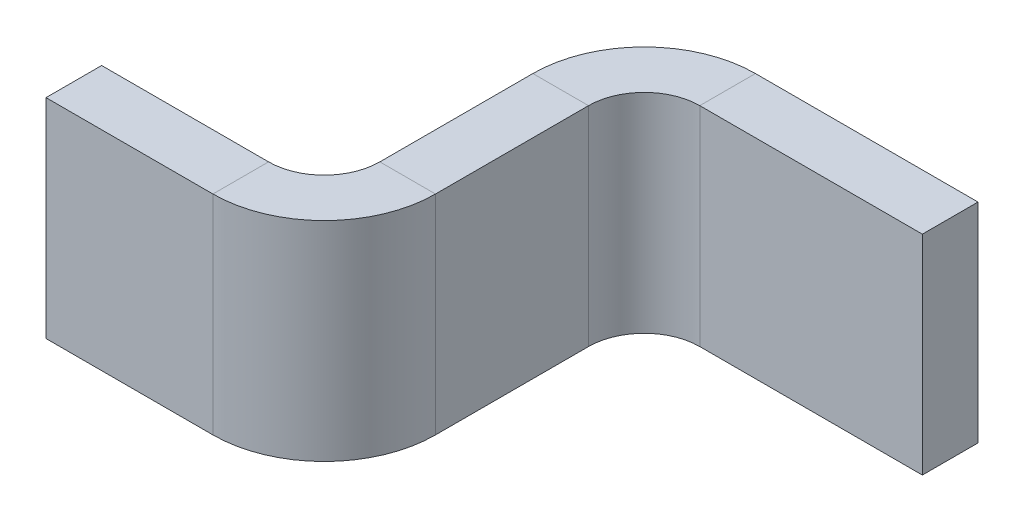
ISO-10303-21;
HEADER;
FILE_DESCRIPTION(('STEP AP214'),'2;1');
FILE_NAME('part.step','',(''),(''),'','','');
FILE_SCHEMA(('AUTOMOTIVE_DESIGN { 1 0 10303 214 1 1 1 1 }'));
ENDSEC;
DATA;
#1=APPLICATION_CONTEXT('core data for automotive mechanical design processes');
#2=APPLICATION_PROTOCOL_DEFINITION('international standard','automotive_design',2000,#1);
#3=PRODUCT_CONTEXT('',#1,'mechanical');
#4=PRODUCT('Part','Part','',(#3));
#5=PRODUCT_RELATED_PRODUCT_CATEGORY('part','',(#4));
#6=PRODUCT_DEFINITION_FORMATION('','',#4);
#7=PRODUCT_DEFINITION_CONTEXT('part definition',#1,'design');
#8=PRODUCT_DEFINITION('design','',#6,#7);
#9=PRODUCT_DEFINITION_SHAPE('','',#8);
#10=(LENGTH_UNIT() NAMED_UNIT(*) SI_UNIT(.MILLI.,.METRE.));
#11=(NAMED_UNIT(*) PLANE_ANGLE_UNIT() SI_UNIT($,.RADIAN.));
#12=(NAMED_UNIT(*) SI_UNIT($,.STERADIAN.) SOLID_ANGLE_UNIT());
#13=UNCERTAINTY_MEASURE_WITH_UNIT(LENGTH_MEASURE(1.E-05),#10,'distance_accuracy_value','');
#14=(GEOMETRIC_REPRESENTATION_CONTEXT(3) GLOBAL_UNCERTAINTY_ASSIGNED_CONTEXT((#13)) GLOBAL_UNIT_ASSIGNED_CONTEXT((#10,
#11,#12)) REPRESENTATION_CONTEXT('',''));
#15=CARTESIAN_POINT('',(0.,0.,0.));
#16=DIRECTION('',(0.,0.,1.));
#17=DIRECTION('',(1.,0.,0.));
#18=AXIS2_PLACEMENT_3D('',#15,#16,#17);
#19=CARTESIAN_POINT('',(0.,-0.1875,0.575));
#20=DIRECTION('',(-1.,0.,0.));
#21=DIRECTION('',(0.,0.,1.));
#22=AXIS2_PLACEMENT_3D('',#19,#20,#21);
#23=PLANE('',#22);
#24=DIRECTION('',(0.,0.,1.));
#25=VECTOR('',#24,1.);
#26=CARTESIAN_POINT('',(0.,-0.1875,0.675));
#27=LINE('',#26,#25);
#28=CARTESIAN_POINT('',(0.,-0.1875,0.575));
#29=VERTEX_POINT('',#28);
#30=CARTESIAN_POINT('',(0.,-0.1875,0.675));
#31=VERTEX_POINT('',#30);
#32=EDGE_CURVE('E11',#29,#31,#27,.T.);
#33=ORIENTED_EDGE('',*,*,#32,.T.);
#34=DIRECTION('',(0.,1.,0.));
#35=VECTOR('',#34,1.);
#36=CARTESIAN_POINT('',(0.,0.1875,0.675));
#37=LINE('',#36,#35);
#38=CARTESIAN_POINT('',(0.,0.1875,0.675));
#39=VERTEX_POINT('',#38);
#40=EDGE_CURVE('E28',#31,#39,#37,.T.);
#41=ORIENTED_EDGE('',*,*,#40,.T.);
#42=DIRECTION('',(0.,0.,-1.));
#43=VECTOR('',#42,1.);
#44=CARTESIAN_POINT('',(0.,0.1875,0.575));
#45=LINE('',#44,#43);
#46=CARTESIAN_POINT('',(0.,0.1875,0.575));
#47=VERTEX_POINT('',#46);
#48=EDGE_CURVE('E148',#39,#47,#45,.T.);
#49=ORIENTED_EDGE('',*,*,#48,.T.);
#50=DIRECTION('',(0.,-1.,0.));
#51=VECTOR('',#50,1.);
#52=CARTESIAN_POINT('',(0.,-0.1875,0.575));
#53=LINE('',#52,#51);
#54=EDGE_CURVE('E194',#47,#29,#53,.T.);
#55=ORIENTED_EDGE('',*,*,#54,.T.);
#56=EDGE_LOOP('',(#33,#41,#49,#55));
#57=FACE_BOUND('',#56,.T.);
#58=ADVANCED_FACE('F17',(#57),#23,.T.);
#59=CARTESIAN_POINT('',(0.,-0.1875,0.575));
#60=DIRECTION('',(0.,0.,1.));
#61=DIRECTION('',(1.,0.,0.));
#62=AXIS2_PLACEMENT_3D('',#59,#60,#61);
#63=PLANE('',#62);
#64=DIRECTION('',(0.,-1.,0.));
#65=VECTOR('',#64,1.);
#66=CARTESIAN_POINT('',(0.3,-0.1875,0.575));
#67=LINE('',#66,#65);
#68=CARTESIAN_POINT('',(0.3,0.1875,0.575));
#69=VERTEX_POINT('',#68);
#70=CARTESIAN_POINT('',(0.3,-0.1875,0.575));
#71=VERTEX_POINT('',#70);
#72=EDGE_CURVE('E207',#69,#71,#67,.T.);
#73=ORIENTED_EDGE('',*,*,#72,.T.);
#74=DIRECTION('',(1.,0.,0.));
#75=VECTOR('',#74,1.);
#76=CARTESIAN_POINT('',(0.,-0.1875,0.575));
#77=LINE('',#76,#75);
#78=EDGE_CURVE('E238',#29,#71,#77,.T.);
#79=ORIENTED_EDGE('',*,*,#78,.F.);
#80=ORIENTED_EDGE('',*,*,#54,.F.);
#81=DIRECTION('',(1.,0.,0.));
#82=VECTOR('',#81,1.);
#83=CARTESIAN_POINT('',(0.,0.1875,0.575));
#84=LINE('',#83,#82);
#85=EDGE_CURVE('E210',#47,#69,#84,.T.);
#86=ORIENTED_EDGE('',*,*,#85,.T.);
#87=EDGE_LOOP('',(#73,#79,#80,#86));
#88=FACE_BOUND('',#87,.T.);
#89=ADVANCED_FACE('F377',(#88),#63,.F.);
#90=CARTESIAN_POINT('',(0.3,-0.1875,0.475));
#91=DIRECTION('',(0.,1.,0.));
#92=DIRECTION('',(0.,0.,-1.));
#93=AXIS2_PLACEMENT_3D('',#90,#91,#92);
#94=CYLINDRICAL_SURFACE('',#93,0.1);
#95=DIRECTION('',(0.,1.,0.));
#96=VECTOR('',#95,1.);
#97=CARTESIAN_POINT('',(0.4,-0.1875,0.475));
#98=LINE('',#97,#96);
#99=CARTESIAN_POINT('',(0.4,-0.1875,0.475));
#100=VERTEX_POINT('',#99);
#101=CARTESIAN_POINT('',(0.4,0.1875,0.475));
#102=VERTEX_POINT('',#101);
#103=EDGE_CURVE('E268',#100,#102,#98,.T.);
#104=ORIENTED_EDGE('',*,*,#103,.F.);
#105=CARTESIAN_POINT('',(0.3,-0.1875,0.475));
#106=DIRECTION('',(0.,1.,0.));
#107=DIRECTION('',(0.,0.,-1.));
#108=AXIS2_PLACEMENT_3D('',#105,#106,#107);
#109=CIRCLE('',#108,0.1);
#110=EDGE_CURVE('E234',#71,#100,#109,.T.);
#111=ORIENTED_EDGE('',*,*,#110,.F.);
#112=ORIENTED_EDGE('',*,*,#72,.F.);
#113=CARTESIAN_POINT('',(0.3,0.1875,0.475));
#114=DIRECTION('',(0.,1.,0.));
#115=DIRECTION('',(0.,0.,-1.));
#116=AXIS2_PLACEMENT_3D('',#113,#114,#115);
#117=CIRCLE('',#116,0.1);
#118=EDGE_CURVE('E160',#69,#102,#117,.T.);
#119=ORIENTED_EDGE('',*,*,#118,.T.);
#120=EDGE_LOOP('',(#104,#111,#112,#119));
#121=FACE_BOUND('',#120,.T.);
#122=ADVANCED_FACE('F381',(#121),#94,.F.);
#123=CARTESIAN_POINT('',(0.4,-0.1875,0.475));
#124=DIRECTION('',(1.,0.,0.));
#125=DIRECTION('',(0.,1.,0.));
#126=AXIS2_PLACEMENT_3D('',#123,#124,#125);
#127=PLANE('',#126);
#128=DIRECTION('',(0.,-1.,0.));
#129=VECTOR('',#128,1.);
#130=CARTESIAN_POINT('',(0.4,-0.1875,0.2));
#131=LINE('',#130,#129);
#132=CARTESIAN_POINT('',(0.4,0.1875,0.2));
#133=VERTEX_POINT('',#132);
#134=CARTESIAN_POINT('',(0.4,-0.1875,0.2));
#135=VERTEX_POINT('',#134);
#136=EDGE_CURVE('E250',#133,#135,#131,.T.);
#137=ORIENTED_EDGE('',*,*,#136,.T.);
#138=DIRECTION('',(0.,0.,-1.));
#139=VECTOR('',#138,1.);
#140=CARTESIAN_POINT('',(0.4,-0.1875,0.475));
#141=LINE('',#140,#139);
#142=EDGE_CURVE('E179',#100,#135,#141,.T.);
#143=ORIENTED_EDGE('',*,*,#142,.F.);
#144=ORIENTED_EDGE('',*,*,#103,.T.);
#145=DIRECTION('',(0.,0.,-1.));
#146=VECTOR('',#145,1.);
#147=CARTESIAN_POINT('',(0.4,0.1875,0.475));
#148=LINE('',#147,#146);
#149=EDGE_CURVE('E21',#102,#133,#148,.T.);
#150=ORIENTED_EDGE('',*,*,#149,.T.);
#151=EDGE_LOOP('',(#137,#143,#144,#150));
#152=FACE_BOUND('',#151,.T.);
#153=ADVANCED_FACE('F397',(#152),#127,.F.);
#154=CARTESIAN_POINT('',(0.6,-0.1875,0.2));
#155=DIRECTION('',(0.,-1.,0.));
#156=DIRECTION('',(0.,0.,-1.));
#157=AXIS2_PLACEMENT_3D('',#154,#155,#156);
#158=CYLINDRICAL_SURFACE('',#157,0.2);
#159=CARTESIAN_POINT('',(0.6,0.1875,0.2));
#160=DIRECTION('',(0.,-1.,0.));
#161=DIRECTION('',(0.,0.,-1.));
#162=AXIS2_PLACEMENT_3D('',#159,#160,#161);
#163=CIRCLE('',#162,0.2);
#164=CARTESIAN_POINT('',(0.6,0.1875,0.));
#165=VERTEX_POINT('',#164);
#166=EDGE_CURVE('E199',#133,#165,#163,.T.);
#167=ORIENTED_EDGE('',*,*,#166,.T.);
#168=DIRECTION('',(0.,-1.,0.));
#169=VECTOR('',#168,1.);
#170=CARTESIAN_POINT('',(0.6,-0.1875,0.));
#171=LINE('',#170,#169);
#172=CARTESIAN_POINT('',(0.6,-0.1875,0.));
#173=VERTEX_POINT('',#172);
#174=EDGE_CURVE('E203',#165,#173,#171,.T.);
#175=ORIENTED_EDGE('',*,*,#174,.T.);
#176=CARTESIAN_POINT('',(0.6,-0.1875,0.2));
#177=DIRECTION('',(0.,-1.,0.));
#178=DIRECTION('',(0.,0.,-1.));
#179=AXIS2_PLACEMENT_3D('',#176,#177,#178);
#180=CIRCLE('',#179,0.2);
#181=EDGE_CURVE('E191',#135,#173,#180,.T.);
#182=ORIENTED_EDGE('',*,*,#181,.F.);
#183=ORIENTED_EDGE('',*,*,#136,.F.);
#184=EDGE_LOOP('',(#167,#175,#182,#183));
#185=FACE_BOUND('',#184,.T.);
#186=ADVANCED_FACE('F304',(#185),#158,.T.);
#187=CARTESIAN_POINT('',(0.6,-0.1875,0.));
#188=DIRECTION('',(0.,0.,1.));
#189=DIRECTION('',(1.,0.,0.));
#190=AXIS2_PLACEMENT_3D('',#187,#188,#189);
#191=PLANE('',#190);
#192=DIRECTION('',(0.,-1.,0.));
#193=VECTOR('',#192,1.);
#194=CARTESIAN_POINT('',(1.,-0.1875,0.));
#195=LINE('',#194,#193);
#196=CARTESIAN_POINT('',(1.,0.1875,0.));
#197=VERTEX_POINT('',#196);
#198=CARTESIAN_POINT('',(1.,-0.1875,0.));
#199=VERTEX_POINT('',#198);
#200=EDGE_CURVE('E214',#197,#199,#195,.T.);
#201=ORIENTED_EDGE('',*,*,#200,.T.);
#202=DIRECTION('',(1.,0.,0.));
#203=VECTOR('',#202,1.);
#204=CARTESIAN_POINT('',(0.6,-0.1875,0.));
#205=LINE('',#204,#203);
#206=EDGE_CURVE('E156',#173,#199,#205,.T.);
#207=ORIENTED_EDGE('',*,*,#206,.F.);
#208=ORIENTED_EDGE('',*,*,#174,.F.);
#209=DIRECTION('',(1.,0.,0.));
#210=VECTOR('',#209,1.);
#211=CARTESIAN_POINT('',(0.6,0.1875,0.));
#212=LINE('',#211,#210);
#213=EDGE_CURVE('E218',#165,#197,#212,.T.);
#214=ORIENTED_EDGE('',*,*,#213,.T.);
#215=EDGE_LOOP('',(#201,#207,#208,#214));
#216=FACE_BOUND('',#215,.T.);
#217=ADVANCED_FACE('F341',(#216),#191,.F.);
#218=CARTESIAN_POINT('',(0.,-0.1875,0.675));
#219=DIRECTION('',(0.,1.,0.));
#220=DIRECTION('',(1.,0.,0.));
#221=AXIS2_PLACEMENT_3D('',#218,#219,#220);
#222=PLANE('',#221);
#223=DIRECTION('',(0.,0.,1.));
#224=VECTOR('',#223,1.);
#225=CARTESIAN_POINT('',(0.3,-0.1875,0.675));
#226=LINE('',#225,#224);
#227=CARTESIAN_POINT('',(0.3,-0.1875,0.675));
#228=VERTEX_POINT('',#227);
#229=EDGE_CURVE('E171',#71,#228,#226,.T.);
#230=ORIENTED_EDGE('',*,*,#229,.T.);
#231=DIRECTION('',(1.,0.,0.));
#232=VECTOR('',#231,1.);
#233=CARTESIAN_POINT('',(0.,-0.1875,0.675));
#234=LINE('',#233,#232);
#235=EDGE_CURVE('E153',#31,#228,#234,.T.);
#236=ORIENTED_EDGE('',*,*,#235,.F.);
#237=ORIENTED_EDGE('',*,*,#32,.F.);
#238=ORIENTED_EDGE('',*,*,#78,.T.);
#239=EDGE_LOOP('',(#230,#236,#237,#238));
#240=FACE_BOUND('',#239,.T.);
#241=ADVANCED_FACE('F19',(#240),#222,.F.);
#242=CARTESIAN_POINT('',(0.406066017178,-0.1875,0.581066017178));
#243=DIRECTION('',(0.,-1.,0.));
#244=DIRECTION('',(0.,0.,-1.));
#245=AXIS2_PLACEMENT_3D('',#242,#243,#244);
#246=PLANE('',#245);
#247=ORIENTED_EDGE('',*,*,#110,.T.);
#248=DIRECTION('',(1.,0.,0.));
#249=VECTOR('',#248,1.);
#250=CARTESIAN_POINT('',(0.5,-0.1875,0.475));
#251=LINE('',#250,#249);
#252=CARTESIAN_POINT('',(0.5,-0.1875,0.475));
#253=VERTEX_POINT('',#252);
#254=EDGE_CURVE('E178',#100,#253,#251,.T.);
#255=ORIENTED_EDGE('',*,*,#254,.T.);
#256=CARTESIAN_POINT('',(0.3,-0.1875,0.475));
#257=DIRECTION('',(0.,1.,0.));
#258=DIRECTION('',(0.,0.,-1.));
#259=AXIS2_PLACEMENT_3D('',#256,#257,#258);
#260=CIRCLE('',#259,0.2);
#261=EDGE_CURVE('E283',#228,#253,#260,.T.);
#262=ORIENTED_EDGE('',*,*,#261,.F.);
#263=ORIENTED_EDGE('',*,*,#229,.F.);
#264=EDGE_LOOP('',(#247,#255,#262,#263));
#265=FACE_BOUND('',#264,.T.);
#266=ADVANCED_FACE('F340',(#265),#246,.T.);
#267=CARTESIAN_POINT('',(0.5,-0.1875,0.475));
#268=DIRECTION('',(0.,1.,0.));
#269=DIRECTION('',(1.,0.,0.));
#270=AXIS2_PLACEMENT_3D('',#267,#268,#269);
#271=PLANE('',#270);
#272=DIRECTION('',(1.,0.,0.));
#273=VECTOR('',#272,1.);
#274=CARTESIAN_POINT('',(0.5,-0.1875,0.2));
#275=LINE('',#274,#273);
#276=CARTESIAN_POINT('',(0.5,-0.1875,0.2));
#277=VERTEX_POINT('',#276);
#278=EDGE_CURVE('E174',#135,#277,#275,.T.);
#279=ORIENTED_EDGE('',*,*,#278,.T.);
#280=DIRECTION('',(0.,0.,-1.));
#281=VECTOR('',#280,1.);
#282=CARTESIAN_POINT('',(0.5,-0.1875,0.475));
#283=LINE('',#282,#281);
#284=EDGE_CURVE('E223',#253,#277,#283,.T.);
#285=ORIENTED_EDGE('',*,*,#284,.F.);
#286=ORIENTED_EDGE('',*,*,#254,.F.);
#287=ORIENTED_EDGE('',*,*,#142,.T.);
#288=EDGE_LOOP('',(#279,#285,#286,#287));
#289=FACE_BOUND('',#288,.T.);
#290=ADVANCED_FACE('F364',(#289),#271,.F.);
#291=CARTESIAN_POINT('',(0.493933982822,-0.1875,0.09393398282202));
#292=DIRECTION('',(0.,-1.,0.));
#293=DIRECTION('',(0.,0.,-1.));
#294=AXIS2_PLACEMENT_3D('',#291,#292,#293);
#295=PLANE('',#294);
#296=ORIENTED_EDGE('',*,*,#181,.T.);
#297=DIRECTION('',(0.,0.,1.));
#298=VECTOR('',#297,1.);
#299=CARTESIAN_POINT('',(0.6,-0.1875,0.1));
#300=LINE('',#299,#298);
#301=CARTESIAN_POINT('',(0.6,-0.1875,0.1));
#302=VERTEX_POINT('',#301);
#303=EDGE_CURVE('E241',#173,#302,#300,.T.);
#304=ORIENTED_EDGE('',*,*,#303,.T.);
#305=CARTESIAN_POINT('',(0.6,-0.1875,0.2));
#306=DIRECTION('',(0.,-1.,0.));
#307=DIRECTION('',(0.,0.,-1.));
#308=AXIS2_PLACEMENT_3D('',#305,#306,#307);
#309=CIRCLE('',#308,0.1);
#310=EDGE_CURVE('E228',#277,#302,#309,.T.);
#311=ORIENTED_EDGE('',*,*,#310,.F.);
#312=ORIENTED_EDGE('',*,*,#278,.F.);
#313=EDGE_LOOP('',(#296,#304,#311,#312));
#314=FACE_BOUND('',#313,.T.);
#315=ADVANCED_FACE('F311',(#314),#295,.T.);
#316=CARTESIAN_POINT('',(0.6,-0.1875,0.1));
#317=DIRECTION('',(0.,1.,0.));
#318=DIRECTION('',(1.,0.,0.));
#319=AXIS2_PLACEMENT_3D('',#316,#317,#318);
#320=PLANE('',#319);
#321=DIRECTION('',(0.,0.,1.));
#322=VECTOR('',#321,1.);
#323=CARTESIAN_POINT('',(1.,-0.1875,0.1));
#324=LINE('',#323,#322);
#325=CARTESIAN_POINT('',(1.,-0.1875,0.1));
#326=VERTEX_POINT('',#325);
#327=EDGE_CURVE('E222',#199,#326,#324,.T.);
#328=ORIENTED_EDGE('',*,*,#327,.T.);
#329=DIRECTION('',(1.,0.,0.));
#330=VECTOR('',#329,1.);
#331=CARTESIAN_POINT('',(0.6,-0.1875,0.1));
#332=LINE('',#331,#330);
#333=EDGE_CURVE('E163',#302,#326,#332,.T.);
#334=ORIENTED_EDGE('',*,*,#333,.F.);
#335=ORIENTED_EDGE('',*,*,#303,.F.);
#336=ORIENTED_EDGE('',*,*,#206,.T.);
#337=EDGE_LOOP('',(#328,#334,#335,#336));
#338=FACE_BOUND('',#337,.T.);
#339=ADVANCED_FACE('F308',(#338),#320,.F.);
#340=CARTESIAN_POINT('',(0.,0.1875,0.675));
#341=DIRECTION('',(0.,0.,-1.));
#342=DIRECTION('',(0.,-1.,0.));
#343=AXIS2_PLACEMENT_3D('',#340,#341,#342);
#344=PLANE('',#343);
#345=DIRECTION('',(0.,1.,0.));
#346=VECTOR('',#345,1.);
#347=CARTESIAN_POINT('',(0.3,0.1875,0.675));
#348=LINE('',#347,#346);
#349=CARTESIAN_POINT('',(0.3,0.1875,0.675));
#350=VERTEX_POINT('',#349);
#351=EDGE_CURVE('E131',#228,#350,#348,.T.);
#352=ORIENTED_EDGE('',*,*,#351,.T.);
#353=DIRECTION('',(1.,0.,0.));
#354=VECTOR('',#353,1.);
#355=CARTESIAN_POINT('',(0.,0.1875,0.675));
#356=LINE('',#355,#354);
#357=EDGE_CURVE('E139',#39,#350,#356,.T.);
#358=ORIENTED_EDGE('',*,*,#357,.F.);
#359=ORIENTED_EDGE('',*,*,#40,.F.);
#360=ORIENTED_EDGE('',*,*,#235,.T.);
#361=EDGE_LOOP('',(#352,#358,#359,#360));
#362=FACE_BOUND('',#361,.T.);
#363=ADVANCED_FACE('F151',(#362),#344,.F.);
#364=CARTESIAN_POINT('',(0.3,0.1875,0.475));
#365=DIRECTION('',(0.,1.,0.));
#366=DIRECTION('',(0.,0.,-1.));
#367=AXIS2_PLACEMENT_3D('',#364,#365,#366);
#368=CYLINDRICAL_SURFACE('',#367,0.2);
#369=ORIENTED_EDGE('',*,*,#261,.T.);
#370=DIRECTION('',(0.,1.,0.));
#371=VECTOR('',#370,1.);
#372=CARTESIAN_POINT('',(0.5,0.1875,0.475));
#373=LINE('',#372,#371);
#374=CARTESIAN_POINT('',(0.5,0.1875,0.475));
#375=VERTEX_POINT('',#374);
#376=EDGE_CURVE('E133',#253,#375,#373,.T.);
#377=ORIENTED_EDGE('',*,*,#376,.T.);
#378=CARTESIAN_POINT('',(0.3,0.1875,0.475));
#379=DIRECTION('',(0.,1.,0.));
#380=DIRECTION('',(0.,0.,-1.));
#381=AXIS2_PLACEMENT_3D('',#378,#379,#380);
#382=CIRCLE('',#381,0.2);
#383=EDGE_CURVE('E126',#350,#375,#382,.T.);
#384=ORIENTED_EDGE('',*,*,#383,.F.);
#385=ORIENTED_EDGE('',*,*,#351,.F.);
#386=EDGE_LOOP('',(#369,#377,#384,#385));
#387=FACE_BOUND('',#386,.T.);
#388=ADVANCED_FACE('F129',(#387),#368,.T.);
#389=CARTESIAN_POINT('',(0.5,0.1875,0.475));
#390=DIRECTION('',(-1.,0.,0.));
#391=DIRECTION('',(0.,0.,1.));
#392=AXIS2_PLACEMENT_3D('',#389,#390,#391);
#393=PLANE('',#392);
#394=DIRECTION('',(0.,1.,0.));
#395=VECTOR('',#394,1.);
#396=CARTESIAN_POINT('',(0.5,0.1875,0.2));
#397=LINE('',#396,#395);
#398=CARTESIAN_POINT('',(0.5,0.1875,0.2));
#399=VERTEX_POINT('',#398);
#400=EDGE_CURVE('E227',#277,#399,#397,.T.);
#401=ORIENTED_EDGE('',*,*,#400,.T.);
#402=DIRECTION('',(0.,0.,-1.));
#403=VECTOR('',#402,1.);
#404=CARTESIAN_POINT('',(0.5,0.1875,0.475));
#405=LINE('',#404,#403);
#406=EDGE_CURVE('E229',#375,#399,#405,.T.);
#407=ORIENTED_EDGE('',*,*,#406,.F.);
#408=ORIENTED_EDGE('',*,*,#376,.F.);
#409=ORIENTED_EDGE('',*,*,#284,.T.);
#410=EDGE_LOOP('',(#401,#407,#408,#409));
#411=FACE_BOUND('',#410,.T.);
#412=ADVANCED_FACE('F372',(#411),#393,.F.);
#413=CARTESIAN_POINT('',(0.6,0.1875,0.2));
#414=DIRECTION('',(0.,-1.,0.));
#415=DIRECTION('',(0.,0.,-1.));
#416=AXIS2_PLACEMENT_3D('',#413,#414,#415);
#417=CYLINDRICAL_SURFACE('',#416,0.1);
#418=DIRECTION('',(0.,-1.,0.));
#419=VECTOR('',#418,1.);
#420=CARTESIAN_POINT('',(0.6,0.1875,0.1));
#421=LINE('',#420,#419);
#422=CARTESIAN_POINT('',(0.6,0.1875,0.1));
#423=VERTEX_POINT('',#422);
#424=EDGE_CURVE('E168',#423,#302,#421,.T.);
#425=ORIENTED_EDGE('',*,*,#424,.F.);
#426=CARTESIAN_POINT('',(0.6,0.1875,0.2));
#427=DIRECTION('',(0.,-1.,0.));
#428=DIRECTION('',(0.,0.,-1.));
#429=AXIS2_PLACEMENT_3D('',#426,#427,#428);
#430=CIRCLE('',#429,0.1);
#431=EDGE_CURVE('E184',#399,#423,#430,.T.);
#432=ORIENTED_EDGE('',*,*,#431,.F.);
#433=ORIENTED_EDGE('',*,*,#400,.F.);
#434=ORIENTED_EDGE('',*,*,#310,.T.);
#435=EDGE_LOOP('',(#425,#432,#433,#434));
#436=FACE_BOUND('',#435,.T.);
#437=ADVANCED_FACE('F318',(#436),#417,.F.);
#438=CARTESIAN_POINT('',(0.6,0.1875,0.1));
#439=DIRECTION('',(0.,0.,-1.));
#440=DIRECTION('',(0.,-1.,0.));
#441=AXIS2_PLACEMENT_3D('',#438,#439,#440);
#442=PLANE('',#441);
#443=DIRECTION('',(0.,1.,0.));
#444=VECTOR('',#443,1.);
#445=CARTESIAN_POINT('',(1.,0.1875,0.1));
#446=LINE('',#445,#444);
#447=CARTESIAN_POINT('',(1.,0.1875,0.1));
#448=VERTEX_POINT('',#447);
#449=EDGE_CURVE('E253',#326,#448,#446,.T.);
#450=ORIENTED_EDGE('',*,*,#449,.T.);
#451=DIRECTION('',(1.,0.,0.));
#452=VECTOR('',#451,1.);
#453=CARTESIAN_POINT('',(0.6,0.1875,0.1));
#454=LINE('',#453,#452);
#455=EDGE_CURVE('E195',#423,#448,#454,.T.);
#456=ORIENTED_EDGE('',*,*,#455,.F.);
#457=ORIENTED_EDGE('',*,*,#424,.T.);
#458=ORIENTED_EDGE('',*,*,#333,.T.);
#459=EDGE_LOOP('',(#450,#456,#457,#458));
#460=FACE_BOUND('',#459,.T.);
#461=ADVANCED_FACE('F315',(#460),#442,.F.);
#462=CARTESIAN_POINT('',(0.,0.1875,0.575));
#463=DIRECTION('',(0.,-1.,0.));
#464=DIRECTION('',(0.,0.,-1.));
#465=AXIS2_PLACEMENT_3D('',#462,#463,#464);
#466=PLANE('',#465);
#467=DIRECTION('',(0.,0.,-1.));
#468=VECTOR('',#467,1.);
#469=CARTESIAN_POINT('',(0.3,0.1875,0.575));
#470=LINE('',#469,#468);
#471=EDGE_CURVE('E146',#350,#69,#470,.T.);
#472=ORIENTED_EDGE('',*,*,#471,.T.);
#473=ORIENTED_EDGE('',*,*,#85,.F.);
#474=ORIENTED_EDGE('',*,*,#48,.F.);
#475=ORIENTED_EDGE('',*,*,#357,.T.);
#476=EDGE_LOOP('',(#472,#473,#474,#475));
#477=FACE_BOUND('',#476,.T.);
#478=ADVANCED_FACE('F144',(#477),#466,.F.);
#479=CARTESIAN_POINT('',(0.406066017178,0.1875,0.581066017178));
#480=DIRECTION('',(0.,1.,0.));
#481=DIRECTION('',(1.,0.,0.));
#482=AXIS2_PLACEMENT_3D('',#479,#480,#481);
#483=PLANE('',#482);
#484=ORIENTED_EDGE('',*,*,#383,.T.);
#485=DIRECTION('',(-1.,0.,0.));
#486=VECTOR('',#485,1.);
#487=CARTESIAN_POINT('',(0.4,0.1875,0.475));
#488=LINE('',#487,#486);
#489=EDGE_CURVE('E140',#375,#102,#488,.T.);
#490=ORIENTED_EDGE('',*,*,#489,.T.);
#491=ORIENTED_EDGE('',*,*,#118,.F.);
#492=ORIENTED_EDGE('',*,*,#471,.F.);
#493=EDGE_LOOP('',(#484,#490,#491,#492));
#494=FACE_BOUND('',#493,.T.);
#495=ADVANCED_FACE('F158',(#494),#483,.T.);
#496=CARTESIAN_POINT('',(0.4,0.1875,0.475));
#497=DIRECTION('',(0.,-1.,0.));
#498=DIRECTION('',(0.,0.,-1.));
#499=AXIS2_PLACEMENT_3D('',#496,#497,#498);
#500=PLANE('',#499);
#501=DIRECTION('',(-1.,0.,0.));
#502=VECTOR('',#501,1.);
#503=CARTESIAN_POINT('',(0.4,0.1875,0.2));
#504=LINE('',#503,#502);
#505=EDGE_CURVE('E233',#399,#133,#504,.T.);
#506=ORIENTED_EDGE('',*,*,#505,.T.);
#507=ORIENTED_EDGE('',*,*,#149,.F.);
#508=ORIENTED_EDGE('',*,*,#489,.F.);
#509=ORIENTED_EDGE('',*,*,#406,.T.);
#510=EDGE_LOOP('',(#506,#507,#508,#509));
#511=FACE_BOUND('',#510,.T.);
#512=ADVANCED_FACE('F356',(#511),#500,.F.);
#513=CARTESIAN_POINT('',(0.493933982822,0.1875,0.09393398282202));
#514=DIRECTION('',(0.,1.,0.));
#515=DIRECTION('',(1.,0.,0.));
#516=AXIS2_PLACEMENT_3D('',#513,#514,#515);
#517=PLANE('',#516);
#518=ORIENTED_EDGE('',*,*,#431,.T.);
#519=DIRECTION('',(0.,0.,-1.));
#520=VECTOR('',#519,1.);
#521=CARTESIAN_POINT('',(0.6,0.1875,0.));
#522=LINE('',#521,#520);
#523=EDGE_CURVE('E180',#423,#165,#522,.T.);
#524=ORIENTED_EDGE('',*,*,#523,.T.);
#525=ORIENTED_EDGE('',*,*,#166,.F.);
#526=ORIENTED_EDGE('',*,*,#505,.F.);
#527=EDGE_LOOP('',(#518,#524,#525,#526));
#528=FACE_BOUND('',#527,.T.);
#529=ADVANCED_FACE('F324',(#528),#517,.T.);
#530=CARTESIAN_POINT('',(0.6,0.1875,0.));
#531=DIRECTION('',(0.,-1.,0.));
#532=DIRECTION('',(0.,0.,-1.));
#533=AXIS2_PLACEMENT_3D('',#530,#531,#532);
#534=PLANE('',#533);
#535=DIRECTION('',(0.,0.,-1.));
#536=VECTOR('',#535,1.);
#537=CARTESIAN_POINT('',(1.,0.1875,0.));
#538=LINE('',#537,#536);
#539=EDGE_CURVE('E185',#448,#197,#538,.T.);
#540=ORIENTED_EDGE('',*,*,#539,.T.);
#541=ORIENTED_EDGE('',*,*,#213,.F.);
#542=ORIENTED_EDGE('',*,*,#523,.F.);
#543=ORIENTED_EDGE('',*,*,#455,.T.);
#544=EDGE_LOOP('',(#540,#541,#542,#543));
#545=FACE_BOUND('',#544,.T.);
#546=ADVANCED_FACE('F322',(#545),#534,.F.);
#547=CARTESIAN_POINT('',(1.,-0.1875,0.));
#548=DIRECTION('',(-1.,0.,0.));
#549=DIRECTION('',(0.,0.,1.));
#550=AXIS2_PLACEMENT_3D('',#547,#548,#549);
#551=PLANE('',#550);
#552=ORIENTED_EDGE('',*,*,#200,.F.);
#553=ORIENTED_EDGE('',*,*,#539,.F.);
#554=ORIENTED_EDGE('',*,*,#449,.F.);
#555=ORIENTED_EDGE('',*,*,#327,.F.);
#556=EDGE_LOOP('',(#552,#553,#554,#555));
#557=FACE_BOUND('',#556,.T.);
#558=ADVANCED_FACE('F420',(#557),#551,.F.);
#559=CLOSED_SHELL('',(#58,#89,#122,#153,#186,#217,#241,#266,#290,#315,#339,#363,#388,#412,#437,
#461,#478,#495,#512,#529,#546,#558));
#560=MANIFOLD_SOLID_BREP('B1',#559);
#561=ADVANCED_BREP_SHAPE_REPRESENTATION('',(#18,#560),#14);
#562=SHAPE_DEFINITION_REPRESENTATION(#9,#561);
ENDSEC;
END-ISO-10303-21;
